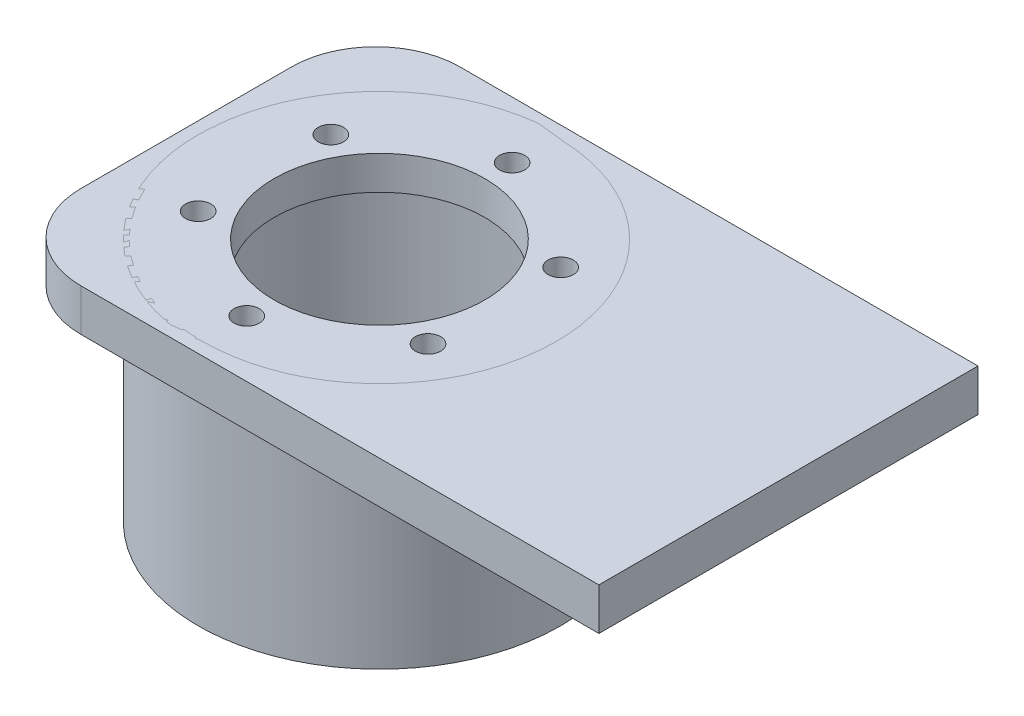
ISO-10303-21;
HEADER;
FILE_DESCRIPTION(('STEP AP214'),'2;1');
FILE_NAME('part.step','',(''),(''),'','','');
FILE_SCHEMA(('AUTOMOTIVE_DESIGN { 1 0 10303 214 1 1 1 1 }'));
ENDSEC;
DATA;
#1=APPLICATION_CONTEXT('core data for automotive mechanical design processes');
#2=APPLICATION_PROTOCOL_DEFINITION('international standard','automotive_design',2000,#1);
#3=PRODUCT_CONTEXT('',#1,'mechanical');
#4=PRODUCT('Part','Part','',(#3));
#5=PRODUCT_RELATED_PRODUCT_CATEGORY('part','',(#4));
#6=PRODUCT_DEFINITION_FORMATION('','',#4);
#7=PRODUCT_DEFINITION_CONTEXT('part definition',#1,'design');
#8=PRODUCT_DEFINITION('design','',#6,#7);
#9=PRODUCT_DEFINITION_SHAPE('','',#8);
#10=(LENGTH_UNIT() NAMED_UNIT(*) SI_UNIT(.MILLI.,.METRE.));
#11=(NAMED_UNIT(*) PLANE_ANGLE_UNIT() SI_UNIT($,.RADIAN.));
#12=(NAMED_UNIT(*) SI_UNIT($,.STERADIAN.) SOLID_ANGLE_UNIT());
#13=UNCERTAINTY_MEASURE_WITH_UNIT(LENGTH_MEASURE(1.E-05),#10,'distance_accuracy_value','');
#14=(GEOMETRIC_REPRESENTATION_CONTEXT(3) GLOBAL_UNCERTAINTY_ASSIGNED_CONTEXT((#13)) GLOBAL_UNIT_ASSIGNED_CONTEXT((#10,
#11,#12)) REPRESENTATION_CONTEXT('',''));
#15=CARTESIAN_POINT('',(0.,0.,0.));
#16=DIRECTION('',(0.,0.,1.));
#17=DIRECTION('',(1.,0.,0.));
#18=AXIS2_PLACEMENT_3D('',#15,#16,#17);
#19=CARTESIAN_POINT('',(0.,-24.,0.));
#20=DIRECTION('',(0.,-1.,0.));
#21=DIRECTION('',(1.,0.,0.));
#22=AXIS2_PLACEMENT_3D('',#19,#20,#21);
#23=PLANE('',#22);
#24=CARTESIAN_POINT('',(0.,-24.,0.));
#25=DIRECTION('',(0.,-1.,0.));
#26=DIRECTION('',(1.,0.,0.));
#27=AXIS2_PLACEMENT_3D('',#24,#25,#26);
#28=CIRCLE('',#27,21.5);
#29=CARTESIAN_POINT('',(21.5,-24.,0.));
#30=VERTEX_POINT('',#29);
#31=EDGE_CURVE('E11',#30,#30,#28,.T.);
#32=ORIENTED_EDGE('',*,*,#31,.T.);
#33=EDGE_LOOP('',(#32));
#34=FACE_BOUND('',#33,.T.);
#35=CARTESIAN_POINT('',(0.,-24.,0.));
#36=DIRECTION('',(0.,-1.,0.));
#37=DIRECTION('',(1.,0.,0.));
#38=AXIS2_PLACEMENT_3D('',#35,#36,#37);
#39=CIRCLE('',#38,19.);
#40=CARTESIAN_POINT('',(19.,-24.,0.));
#41=VERTEX_POINT('',#40);
#42=EDGE_CURVE('E54',#41,#41,#39,.T.);
#43=ORIENTED_EDGE('',*,*,#42,.F.);
#44=EDGE_LOOP('',(#43));
#45=FACE_BOUND('',#44,.T.);
#46=ADVANCED_FACE('F47',(#34,#45),#23,.T.);
#47=CARTESIAN_POINT('',(0.,-24.,0.));
#48=DIRECTION('',(0.,1.,0.));
#49=DIRECTION('',(-1.,0.,0.));
#50=AXIS2_PLACEMENT_3D('',#47,#48,#49);
#51=CYLINDRICAL_SURFACE('',#50,21.5);
#52=ORIENTED_EDGE('',*,*,#31,.F.);
#53=EDGE_LOOP('',(#52));
#54=FACE_BOUND('',#53,.T.);
#55=CARTESIAN_POINT('',(0.,5.,0.));
#56=DIRECTION('',(0.,1.,0.));
#57=DIRECTION('',(-1.,0.,0.));
#58=AXIS2_PLACEMENT_3D('',#55,#56,#57);
#59=CIRCLE('',#58,21.5);
#60=CARTESIAN_POINT('',(-21.5,5.,0.));
#61=VERTEX_POINT('',#60);
#62=EDGE_CURVE('E63',#61,#61,#59,.T.);
#63=ORIENTED_EDGE('',*,*,#62,.F.);
#64=EDGE_LOOP('',(#63));
#65=FACE_BOUND('',#64,.T.);
#66=ADVANCED_FACE('F49',(#54,#65),#51,.T.);
#67=CARTESIAN_POINT('',(0.,-24.,0.));
#68=DIRECTION('',(0.,1.,0.));
#69=DIRECTION('',(-1.,0.,0.));
#70=AXIS2_PLACEMENT_3D('',#67,#68,#69);
#71=CYLINDRICAL_SURFACE('',#70,19.);
#72=ORIENTED_EDGE('',*,*,#42,.T.);
#73=EDGE_LOOP('',(#72));
#74=FACE_BOUND('',#73,.T.);
#75=CARTESIAN_POINT('',(0.,1.,0.));
#76=DIRECTION('',(0.,-1.,0.));
#77=DIRECTION('',(1.,0.,0.));
#78=AXIS2_PLACEMENT_3D('',#75,#76,#77);
#79=CIRCLE('',#78,19.);
#80=CARTESIAN_POINT('',(19.,1.,0.));
#81=VERTEX_POINT('',#80);
#82=EDGE_CURVE('E58',#81,#81,#79,.T.);
#83=ORIENTED_EDGE('',*,*,#82,.F.);
#84=EDGE_LOOP('',(#83));
#85=FACE_BOUND('',#84,.T.);
#86=ADVANCED_FACE('F136',(#74,#85),#71,.F.);
#87=CARTESIAN_POINT('',(0.,1.,0.));
#88=DIRECTION('',(0.,1.,0.));
#89=DIRECTION('',(-1.,0.,0.));
#90=AXIS2_PLACEMENT_3D('',#87,#88,#89);
#91=PLANE('',#90);
#92=CARTESIAN_POINT('',(-13.6399001096048,1.,7.87500000000016));
#93=DIRECTION('',(0.,1.,0.));
#94=DIRECTION('',(-1.,0.,0.));
#95=AXIS2_PLACEMENT_3D('',#92,#93,#94);
#96=CIRCLE('',#95,1.5);
#97=CARTESIAN_POINT('',(-15.1399001096048,1.,7.87500000000016));
#98=VERTEX_POINT('',#97);
#99=EDGE_CURVE('E79',#98,#98,#96,.T.);
#100=ORIENTED_EDGE('',*,*,#99,.T.);
#101=EDGE_LOOP('',(#100));
#102=FACE_BOUND('',#101,.T.);
#103=CARTESIAN_POINT('',(-13.639900109605,1.,-7.87499999999987));
#104=DIRECTION('',(0.,1.,0.));
#105=DIRECTION('',(-1.,0.,0.));
#106=AXIS2_PLACEMENT_3D('',#103,#104,#105);
#107=CIRCLE('',#106,1.5);
#108=CARTESIAN_POINT('',(-15.139900109605,1.,-7.87499999999987));
#109=VERTEX_POINT('',#108);
#110=EDGE_CURVE('E82',#109,#109,#107,.T.);
#111=ORIENTED_EDGE('',*,*,#110,.T.);
#112=EDGE_LOOP('',(#111));
#113=FACE_BOUND('',#112,.T.);
#114=CARTESIAN_POINT('',(0.,1.,-15.75));
#115=DIRECTION('',(0.,1.,0.));
#116=DIRECTION('',(-1.,0.,0.));
#117=AXIS2_PLACEMENT_3D('',#114,#115,#116);
#118=CIRCLE('',#117,1.5);
#119=CARTESIAN_POINT('',(-1.5,1.,-15.75));
#120=VERTEX_POINT('',#119);
#121=EDGE_CURVE('E85',#120,#120,#118,.T.);
#122=ORIENTED_EDGE('',*,*,#121,.T.);
#123=EDGE_LOOP('',(#122));
#124=FACE_BOUND('',#123,.T.);
#125=CARTESIAN_POINT('',(13.6399001096049,1.,-7.87500000000006));
#126=DIRECTION('',(0.,1.,0.));
#127=DIRECTION('',(-1.,0.,0.));
#128=AXIS2_PLACEMENT_3D('',#125,#126,#127);
#129=CIRCLE('',#128,1.5);
#130=CARTESIAN_POINT('',(12.1399001096049,1.,-7.87500000000006));
#131=VERTEX_POINT('',#130);
#132=EDGE_CURVE('E88',#131,#131,#129,.T.);
#133=ORIENTED_EDGE('',*,*,#132,.T.);
#134=EDGE_LOOP('',(#133));
#135=FACE_BOUND('',#134,.T.);
#136=CARTESIAN_POINT('',(13.6399001096049,1.,7.87499999999997));
#137=DIRECTION('',(0.,1.,0.));
#138=DIRECTION('',(-1.,0.,0.));
#139=AXIS2_PLACEMENT_3D('',#136,#137,#138);
#140=CIRCLE('',#139,1.5);
#141=CARTESIAN_POINT('',(12.1399001096049,1.,7.87499999999997));
#142=VERTEX_POINT('',#141);
#143=EDGE_CURVE('E91',#142,#142,#140,.T.);
#144=ORIENTED_EDGE('',*,*,#143,.T.);
#145=EDGE_LOOP('',(#144));
#146=FACE_BOUND('',#145,.T.);
#147=CARTESIAN_POINT('',(0.,1.,15.75));
#148=DIRECTION('',(0.,1.,0.));
#149=DIRECTION('',(-1.,0.,0.));
#150=AXIS2_PLACEMENT_3D('',#147,#148,#149);
#151=CIRCLE('',#150,1.5);
#152=CARTESIAN_POINT('',(-1.5,1.,15.75));
#153=VERTEX_POINT('',#152);
#154=EDGE_CURVE('E71',#153,#153,#151,.T.);
#155=ORIENTED_EDGE('',*,*,#154,.T.);
#156=EDGE_LOOP('',(#155));
#157=FACE_BOUND('',#156,.T.);
#158=CARTESIAN_POINT('',(0.,1.,0.));
#159=DIRECTION('',(0.,1.,0.));
#160=DIRECTION('',(-1.,0.,0.));
#161=AXIS2_PLACEMENT_3D('',#158,#159,#160);
#162=CIRCLE('',#161,12.5);
#163=CARTESIAN_POINT('',(-12.5,1.,0.));
#164=VERTEX_POINT('',#163);
#165=EDGE_CURVE('E68',#164,#164,#162,.T.);
#166=ORIENTED_EDGE('',*,*,#165,.T.);
#167=EDGE_LOOP('',(#166));
#168=FACE_BOUND('',#167,.T.);
#169=ORIENTED_EDGE('',*,*,#82,.T.);
#170=EDGE_LOOP('',(#169));
#171=FACE_BOUND('',#170,.T.);
#172=ADVANCED_FACE('F117',(#102,#113,#124,#135,#146,#157,#168,#171),#91,.F.);
#173=CARTESIAN_POINT('',(0.,5.,0.));
#174=DIRECTION('',(0.,1.,0.));
#175=DIRECTION('',(-1.,0.,0.));
#176=AXIS2_PLACEMENT_3D('',#173,#174,#175);
#177=PLANE('',#176);
#178=CARTESIAN_POINT('',(-13.6399001096048,5.,7.87500000000016));
#179=DIRECTION('',(0.,1.,0.));
#180=DIRECTION('',(-0.50000000000001,0.,-0.866025403784433));
#181=AXIS2_PLACEMENT_3D('',#178,#179,#180);
#182=CIRCLE('',#181,1.5);
#183=CARTESIAN_POINT('',(-14.3899001096048,5.,6.57596189432351));
#184=VERTEX_POINT('',#183);
#185=EDGE_CURVE('E98',#184,#184,#182,.T.);
#186=ORIENTED_EDGE('',*,*,#185,.F.);
#187=EDGE_LOOP('',(#186));
#188=FACE_BOUND('',#187,.T.);
#189=CARTESIAN_POINT('',(-13.639900109605,5.,-7.87499999999987));
#190=DIRECTION('',(0.,1.,0.));
#191=DIRECTION('',(0.499999999999992,0.,-0.866025403784443));
#192=AXIS2_PLACEMENT_3D('',#189,#190,#191);
#193=CIRCLE('',#192,1.5);
#194=CARTESIAN_POINT('',(-12.889900109605,5.,-9.17403810567654));
#195=VERTEX_POINT('',#194);
#196=EDGE_CURVE('E101',#195,#195,#193,.T.);
#197=ORIENTED_EDGE('',*,*,#196,.F.);
#198=EDGE_LOOP('',(#197));
#199=FACE_BOUND('',#198,.T.);
#200=CARTESIAN_POINT('',(0.,5.,-15.75));
#201=DIRECTION('',(0.,1.,0.));
#202=DIRECTION('',(1.,0.,0.));
#203=AXIS2_PLACEMENT_3D('',#200,#201,#202);
#204=CIRCLE('',#203,1.5);
#205=CARTESIAN_POINT('',(1.5,5.,-15.75));
#206=VERTEX_POINT('',#205);
#207=EDGE_CURVE('E104',#206,#206,#204,.T.);
#208=ORIENTED_EDGE('',*,*,#207,.F.);
#209=EDGE_LOOP('',(#208));
#210=FACE_BOUND('',#209,.T.);
#211=CARTESIAN_POINT('',(13.6399001096049,5.,-7.87500000000006));
#212=DIRECTION('',(0.,1.,0.));
#213=DIRECTION('',(0.500000000000004,0.,0.866025403784436));
#214=AXIS2_PLACEMENT_3D('',#211,#212,#213);
#215=CIRCLE('',#214,1.5);
#216=CARTESIAN_POINT('',(14.3899001096049,5.,-6.57596189432341));
#217=VERTEX_POINT('',#216);
#218=EDGE_CURVE('E97',#217,#217,#215,.T.);
#219=ORIENTED_EDGE('',*,*,#218,.F.);
#220=EDGE_LOOP('',(#219));
#221=FACE_BOUND('',#220,.T.);
#222=CARTESIAN_POINT('',(13.6399001096049,5.,7.87499999999997));
#223=DIRECTION('',(0.,1.,0.));
#224=DIRECTION('',(-0.499999999999998,0.,0.86602540378444));
#225=AXIS2_PLACEMENT_3D('',#222,#223,#224);
#226=CIRCLE('',#225,1.5);
#227=CARTESIAN_POINT('',(12.8899001096049,5.,9.17403810567663));
#228=VERTEX_POINT('',#227);
#229=EDGE_CURVE('E94',#228,#228,#226,.T.);
#230=ORIENTED_EDGE('',*,*,#229,.F.);
#231=EDGE_LOOP('',(#230));
#232=FACE_BOUND('',#231,.T.);
#233=CARTESIAN_POINT('',(0.,5.,15.75));
#234=DIRECTION('',(0.,1.,0.));
#235=DIRECTION('',(-1.,0.,0.));
#236=AXIS2_PLACEMENT_3D('',#233,#234,#235);
#237=CIRCLE('',#236,1.5);
#238=CARTESIAN_POINT('',(-1.5,5.,15.75));
#239=VERTEX_POINT('',#238);
#240=EDGE_CURVE('E76',#239,#239,#237,.T.);
#241=ORIENTED_EDGE('',*,*,#240,.F.);
#242=EDGE_LOOP('',(#241));
#243=FACE_BOUND('',#242,.T.);
#244=ORIENTED_EDGE('',*,*,#62,.T.);
#245=EDGE_LOOP('',(#244));
#246=FACE_BOUND('',#245,.T.);
#247=CARTESIAN_POINT('',(0.,5.,0.));
#248=DIRECTION('',(0.,1.,0.));
#249=DIRECTION('',(-1.,0.,0.));
#250=AXIS2_PLACEMENT_3D('',#247,#248,#249);
#251=CIRCLE('',#250,12.5);
#252=CARTESIAN_POINT('',(-12.5,5.,0.));
#253=VERTEX_POINT('',#252);
#254=EDGE_CURVE('E67',#253,#253,#251,.T.);
#255=ORIENTED_EDGE('',*,*,#254,.F.);
#256=EDGE_LOOP('',(#255));
#257=FACE_BOUND('',#256,.T.);
#258=ADVANCED_FACE('F113',(#188,#199,#210,#221,#232,#243,#246,#257),#177,.T.);
#259=CARTESIAN_POINT('',(0.,5.,0.));
#260=DIRECTION('',(0.,-1.,0.));
#261=DIRECTION('',(1.,0.,0.));
#262=AXIS2_PLACEMENT_3D('',#259,#260,#261);
#263=CYLINDRICAL_SURFACE('',#262,12.5);
#264=ORIENTED_EDGE('',*,*,#254,.T.);
#265=EDGE_LOOP('',(#264));
#266=FACE_BOUND('',#265,.T.);
#267=ORIENTED_EDGE('',*,*,#165,.F.);
#268=EDGE_LOOP('',(#267));
#269=FACE_BOUND('',#268,.T.);
#270=ADVANCED_FACE('F116',(#266,#269),#263,.F.);
#271=CARTESIAN_POINT('',(0.,0.,15.75));
#272=DIRECTION('',(0.,1.,0.));
#273=DIRECTION('',(-1.,0.,0.));
#274=AXIS2_PLACEMENT_3D('',#271,#272,#273);
#275=CYLINDRICAL_SURFACE('',#274,1.5);
#276=ORIENTED_EDGE('',*,*,#240,.T.);
#277=EDGE_LOOP('',(#276));
#278=FACE_BOUND('',#277,.T.);
#279=ORIENTED_EDGE('',*,*,#154,.F.);
#280=EDGE_LOOP('',(#279));
#281=FACE_BOUND('',#280,.T.);
#282=ADVANCED_FACE('F130',(#278,#281),#275,.F.);
#283=CARTESIAN_POINT('',(13.6399001096049,0.,7.87499999999997));
#284=DIRECTION('',(0.,1.,0.));
#285=DIRECTION('',(-1.,0.,0.));
#286=AXIS2_PLACEMENT_3D('',#283,#284,#285);
#287=CYLINDRICAL_SURFACE('',#286,1.5);
#288=ORIENTED_EDGE('',*,*,#229,.T.);
#289=EDGE_LOOP('',(#288));
#290=FACE_BOUND('',#289,.T.);
#291=ORIENTED_EDGE('',*,*,#143,.F.);
#292=EDGE_LOOP('',(#291));
#293=FACE_BOUND('',#292,.T.);
#294=ADVANCED_FACE('F178',(#290,#293),#287,.F.);
#295=CARTESIAN_POINT('',(13.6399001096049,0.,-7.87500000000006));
#296=DIRECTION('',(0.,1.,0.));
#297=DIRECTION('',(-1.,0.,0.));
#298=AXIS2_PLACEMENT_3D('',#295,#296,#297);
#299=CYLINDRICAL_SURFACE('',#298,1.5);
#300=ORIENTED_EDGE('',*,*,#218,.T.);
#301=EDGE_LOOP('',(#300));
#302=FACE_BOUND('',#301,.T.);
#303=ORIENTED_EDGE('',*,*,#132,.F.);
#304=EDGE_LOOP('',(#303));
#305=FACE_BOUND('',#304,.T.);
#306=ADVANCED_FACE('F110',(#302,#305),#299,.F.);
#307=CARTESIAN_POINT('',(0.,0.,-15.75));
#308=DIRECTION('',(0.,1.,0.));
#309=DIRECTION('',(-1.,0.,0.));
#310=AXIS2_PLACEMENT_3D('',#307,#308,#309);
#311=CYLINDRICAL_SURFACE('',#310,1.5);
#312=ORIENTED_EDGE('',*,*,#207,.T.);
#313=EDGE_LOOP('',(#312));
#314=FACE_BOUND('',#313,.T.);
#315=ORIENTED_EDGE('',*,*,#121,.F.);
#316=EDGE_LOOP('',(#315));
#317=FACE_BOUND('',#316,.T.);
#318=ADVANCED_FACE('F194',(#314,#317),#311,.F.);
#319=CARTESIAN_POINT('',(-13.639900109605,0.,-7.87499999999987));
#320=DIRECTION('',(0.,1.,0.));
#321=DIRECTION('',(-1.,0.,0.));
#322=AXIS2_PLACEMENT_3D('',#319,#320,#321);
#323=CYLINDRICAL_SURFACE('',#322,1.5);
#324=ORIENTED_EDGE('',*,*,#196,.T.);
#325=EDGE_LOOP('',(#324));
#326=FACE_BOUND('',#325,.T.);
#327=ORIENTED_EDGE('',*,*,#110,.F.);
#328=EDGE_LOOP('',(#327));
#329=FACE_BOUND('',#328,.T.);
#330=ADVANCED_FACE('F201',(#326,#329),#323,.F.);
#331=CARTESIAN_POINT('',(-13.6399001096048,0.,7.87500000000016));
#332=DIRECTION('',(0.,1.,0.));
#333=DIRECTION('',(-1.,0.,0.));
#334=AXIS2_PLACEMENT_3D('',#331,#332,#333);
#335=CYLINDRICAL_SURFACE('',#334,1.5);
#336=ORIENTED_EDGE('',*,*,#185,.T.);
#337=EDGE_LOOP('',(#336));
#338=FACE_BOUND('',#337,.T.);
#339=ORIENTED_EDGE('',*,*,#99,.F.);
#340=EDGE_LOOP('',(#339));
#341=FACE_BOUND('',#340,.T.);
#342=ADVANCED_FACE('F209',(#338,#341),#335,.F.);
#343=CLOSED_SHELL('',(#46,#66,#86,#172,#258,#270,#282,#294,#306,#318,#330,#342));
#344=MANIFOLD_SOLID_BREP('B2',#343);
#345=CARTESIAN_POINT('',(48.55,5.,-22.5));
#346=DIRECTION('',(-1.,0.,0.));
#347=DIRECTION('',(0.,0.,1.));
#348=AXIS2_PLACEMENT_3D('',#345,#346,#347);
#349=PLANE('',#348);
#350=DIRECTION('',(0.,0.,-1.));
#351=VECTOR('',#350,1.);
#352=CARTESIAN_POINT('',(48.55,0.,-22.5));
#353=LINE('',#352,#351);
#354=CARTESIAN_POINT('',(48.55,0.,22.5));
#355=VERTEX_POINT('',#354);
#356=CARTESIAN_POINT('',(48.55,0.,-22.5));
#357=VERTEX_POINT('',#356);
#358=EDGE_CURVE('E318',#355,#357,#353,.T.);
#359=ORIENTED_EDGE('',*,*,#358,.T.);
#360=DIRECTION('',(0.,-1.,0.));
#361=VECTOR('',#360,1.);
#362=CARTESIAN_POINT('',(48.55,5.,-22.5));
#363=LINE('',#362,#361);
#364=CARTESIAN_POINT('',(48.55,5.,-22.5));
#365=VERTEX_POINT('',#364);
#366=EDGE_CURVE('E301',#365,#357,#363,.T.);
#367=ORIENTED_EDGE('',*,*,#366,.F.);
#368=DIRECTION('',(0.,0.,-1.));
#369=VECTOR('',#368,1.);
#370=CARTESIAN_POINT('',(48.55,5.,-22.5));
#371=LINE('',#370,#369);
#372=CARTESIAN_POINT('',(48.55,5.,22.5));
#373=VERTEX_POINT('',#372);
#374=EDGE_CURVE('E307',#373,#365,#371,.T.);
#375=ORIENTED_EDGE('',*,*,#374,.F.);
#376=DIRECTION('',(0.,-1.,0.));
#377=VECTOR('',#376,1.);
#378=CARTESIAN_POINT('',(48.55,5.,22.5));
#379=LINE('',#378,#377);
#380=EDGE_CURVE('E320',#373,#355,#379,.T.);
#381=ORIENTED_EDGE('',*,*,#380,.T.);
#382=EDGE_LOOP('',(#359,#367,#375,#381));
#383=FACE_BOUND('',#382,.T.);
#384=ADVANCED_FACE('F244',(#383),#349,.F.);
#385=CARTESIAN_POINT('',(-61.45,5.,-22.5));
#386=DIRECTION('',(0.,0.,1.));
#387=DIRECTION('',(1.,0.,0.));
#388=AXIS2_PLACEMENT_3D('',#385,#386,#387);
#389=PLANE('',#388);
#390=DIRECTION('',(-1.,0.,0.));
#391=VECTOR('',#390,1.);
#392=CARTESIAN_POINT('',(-61.45,0.,-22.5));
#393=LINE('',#392,#391);
#394=CARTESIAN_POINT('',(-12.9349943342321,0.,-22.5));
#395=VERTEX_POINT('',#394);
#396=EDGE_CURVE('E355',#357,#395,#393,.T.);
#397=ORIENTED_EDGE('',*,*,#396,.T.);
#398=DIRECTION('',(0.,1.,0.));
#399=VECTOR('',#398,1.);
#400=CARTESIAN_POINT('',(-12.9349943342321,5.,-22.5));
#401=LINE('',#400,#399);
#402=CARTESIAN_POINT('',(-12.9349943342321,5.,-22.5));
#403=VERTEX_POINT('',#402);
#404=EDGE_CURVE('E304',#395,#403,#401,.T.);
#405=ORIENTED_EDGE('',*,*,#404,.T.);
#406=DIRECTION('',(-1.,0.,0.));
#407=VECTOR('',#406,1.);
#408=CARTESIAN_POINT('',(-61.45,5.,-22.5));
#409=LINE('',#408,#407);
#410=EDGE_CURVE('E296',#365,#403,#409,.T.);
#411=ORIENTED_EDGE('',*,*,#410,.F.);
#412=ORIENTED_EDGE('',*,*,#366,.T.);
#413=EDGE_LOOP('',(#397,#405,#411,#412));
#414=FACE_BOUND('',#413,.T.);
#415=ADVANCED_FACE('F299',(#414),#389,.F.);
#416=CARTESIAN_POINT('',(-61.45,5.,22.5));
#417=DIRECTION('',(0.,0.,-1.));
#418=DIRECTION('',(-1.,0.,0.));
#419=AXIS2_PLACEMENT_3D('',#416,#417,#418);
#420=PLANE('',#419);
#421=DIRECTION('',(1.,0.,0.));
#422=VECTOR('',#421,1.);
#423=CARTESIAN_POINT('',(-61.45,5.,22.5));
#424=LINE('',#423,#422);
#425=CARTESIAN_POINT('',(-12.9349943342321,5.,22.5));
#426=VERTEX_POINT('',#425);
#427=EDGE_CURVE('E306',#426,#373,#424,.T.);
#428=ORIENTED_EDGE('',*,*,#427,.F.);
#429=DIRECTION('',(0.,1.,0.));
#430=VECTOR('',#429,1.);
#431=CARTESIAN_POINT('',(-12.9349943342321,5.,22.5));
#432=LINE('',#431,#430);
#433=CARTESIAN_POINT('',(-12.9349943342321,0.,22.5));
#434=VERTEX_POINT('',#433);
#435=EDGE_CURVE('E252',#426,#434,#432,.F.);
#436=ORIENTED_EDGE('',*,*,#435,.T.);
#437=DIRECTION('',(1.,0.,0.));
#438=VECTOR('',#437,1.);
#439=CARTESIAN_POINT('',(-61.45,0.,22.5));
#440=LINE('',#439,#438);
#441=EDGE_CURVE('E315',#434,#355,#440,.T.);
#442=ORIENTED_EDGE('',*,*,#441,.T.);
#443=ORIENTED_EDGE('',*,*,#380,.F.);
#444=EDGE_LOOP('',(#428,#436,#442,#443));
#445=FACE_BOUND('',#444,.T.);
#446=ADVANCED_FACE('F356',(#445),#420,.F.);
#447=CARTESIAN_POINT('',(0.,5.,0.));
#448=DIRECTION('',(0.,1.,0.));
#449=DIRECTION('',(0.,0.,1.));
#450=AXIS2_PLACEMENT_3D('',#447,#448,#449);
#451=PLANE('',#450);
#452=DIRECTION('',(0.,0.,-1.));
#453=VECTOR('',#452,1.);
#454=CARTESIAN_POINT('',(-22.9349943342321,5.,-22.5));
#455=LINE('',#454,#453);
#456=CARTESIAN_POINT('',(-22.9349943342321,5.,12.5));
#457=VERTEX_POINT('',#456);
#458=CARTESIAN_POINT('',(-22.9349943342321,5.,-12.5));
#459=VERTEX_POINT('',#458);
#460=EDGE_CURVE('E341',#457,#459,#455,.T.);
#461=ORIENTED_EDGE('',*,*,#460,.F.);
#462=CARTESIAN_POINT('',(-12.9349943342321,5.,12.5));
#463=DIRECTION('',(0.,1.,0.));
#464=DIRECTION('',(0.,0.,1.));
#465=AXIS2_PLACEMENT_3D('',#462,#463,#464);
#466=CIRCLE('',#465,10.);
#467=EDGE_CURVE('E266',#457,#426,#466,.T.);
#468=ORIENTED_EDGE('',*,*,#467,.T.);
#469=ORIENTED_EDGE('',*,*,#427,.T.);
#470=ORIENTED_EDGE('',*,*,#374,.T.);
#471=ORIENTED_EDGE('',*,*,#410,.T.);
#472=CARTESIAN_POINT('',(-12.9349943342321,5.,-12.5));
#473=DIRECTION('',(0.,1.,0.));
#474=DIRECTION('',(0.,0.,1.));
#475=AXIS2_PLACEMENT_3D('',#472,#473,#474);
#476=CIRCLE('',#475,10.);
#477=EDGE_CURVE('E327',#403,#459,#476,.T.);
#478=ORIENTED_EDGE('',*,*,#477,.T.);
#479=EDGE_LOOP('',(#461,#468,#469,#470,#471,#478));
#480=FACE_BOUND('',#479,.T.);
#481=CARTESIAN_POINT('',(0.,5.,0.));
#482=DIRECTION('',(0.,1.,0.));
#483=DIRECTION('',(0.,0.,1.));
#484=AXIS2_PLACEMENT_3D('',#481,#482,#483);
#485=CIRCLE('',#484,21.);
#486=CARTESIAN_POINT('',(0.,5.,21.));
#487=VERTEX_POINT('',#486);
#488=EDGE_CURVE('E345',#487,#487,#485,.T.);
#489=ORIENTED_EDGE('',*,*,#488,.F.);
#490=EDGE_LOOP('',(#489));
#491=FACE_BOUND('',#490,.T.);
#492=ADVANCED_FACE('F310',(#480,#491),#451,.T.);
#493=CARTESIAN_POINT('',(0.,0.,0.));
#494=DIRECTION('',(0.,1.,0.));
#495=DIRECTION('',(0.,0.,1.));
#496=AXIS2_PLACEMENT_3D('',#493,#494,#495);
#497=PLANE('',#496);
#498=CARTESIAN_POINT('',(0.,0.,0.));
#499=DIRECTION('',(0.,1.,0.));
#500=DIRECTION('',(0.,0.,1.));
#501=AXIS2_PLACEMENT_3D('',#498,#499,#500);
#502=CIRCLE('',#501,21.);
#503=CARTESIAN_POINT('',(0.,0.,21.));
#504=VERTEX_POINT('',#503);
#505=EDGE_CURVE('E348',#504,#504,#502,.T.);
#506=ORIENTED_EDGE('',*,*,#505,.T.);
#507=EDGE_LOOP('',(#506));
#508=FACE_BOUND('',#507,.T.);
#509=ORIENTED_EDGE('',*,*,#441,.F.);
#510=CARTESIAN_POINT('',(-12.9349943342321,0.,12.5));
#511=DIRECTION('',(0.,1.,0.));
#512=DIRECTION('',(0.,0.,1.));
#513=AXIS2_PLACEMENT_3D('',#510,#511,#512);
#514=CIRCLE('',#513,10.);
#515=CARTESIAN_POINT('',(-22.9349943342321,0.,12.5));
#516=VERTEX_POINT('',#515);
#517=EDGE_CURVE('E45',#434,#516,#514,.F.);
#518=ORIENTED_EDGE('',*,*,#517,.T.);
#519=DIRECTION('',(0.,0.,-1.));
#520=VECTOR('',#519,1.);
#521=CARTESIAN_POINT('',(-22.9349943342321,0.,0.));
#522=LINE('',#521,#520);
#523=CARTESIAN_POINT('',(-22.9349943342321,0.,-12.5));
#524=VERTEX_POINT('',#523);
#525=EDGE_CURVE('E319',#516,#524,#522,.T.);
#526=ORIENTED_EDGE('',*,*,#525,.T.);
#527=CARTESIAN_POINT('',(-12.9349943342321,0.,-12.5));
#528=DIRECTION('',(0.,1.,0.));
#529=DIRECTION('',(0.,0.,1.));
#530=AXIS2_PLACEMENT_3D('',#527,#528,#529);
#531=CIRCLE('',#530,10.);
#532=EDGE_CURVE('E332',#524,#395,#531,.F.);
#533=ORIENTED_EDGE('',*,*,#532,.T.);
#534=ORIENTED_EDGE('',*,*,#396,.F.);
#535=ORIENTED_EDGE('',*,*,#358,.F.);
#536=EDGE_LOOP('',(#509,#518,#526,#533,#534,#535));
#537=FACE_BOUND('',#536,.T.);
#538=ADVANCED_FACE('F358',(#508,#537),#497,.F.);
#539=CARTESIAN_POINT('',(0.,0.,0.));
#540=DIRECTION('',(0.,1.,0.));
#541=DIRECTION('',(0.,0.,1.));
#542=AXIS2_PLACEMENT_3D('',#539,#540,#541);
#543=CYLINDRICAL_SURFACE('',#542,21.);
#544=ORIENTED_EDGE('',*,*,#505,.F.);
#545=EDGE_LOOP('',(#544));
#546=FACE_BOUND('',#545,.T.);
#547=ORIENTED_EDGE('',*,*,#488,.T.);
#548=EDGE_LOOP('',(#547));
#549=FACE_BOUND('',#548,.T.);
#550=ADVANCED_FACE('F367',(#546,#549),#543,.F.);
#551=CARTESIAN_POINT('',(-22.9349943342321,-5.,-22.5));
#552=DIRECTION('',(1.,0.,0.));
#553=DIRECTION('',(0.,0.,-1.));
#554=AXIS2_PLACEMENT_3D('',#551,#552,#553);
#555=PLANE('',#554);
#556=ORIENTED_EDGE('',*,*,#525,.F.);
#557=DIRECTION('',(0.,1.,0.));
#558=VECTOR('',#557,1.);
#559=CARTESIAN_POINT('',(-22.9349943342321,-5.,12.5));
#560=LINE('',#559,#558);
#561=EDGE_CURVE('E334',#516,#457,#560,.T.);
#562=ORIENTED_EDGE('',*,*,#561,.T.);
#563=ORIENTED_EDGE('',*,*,#460,.T.);
#564=DIRECTION('',(0.,1.,0.));
#565=VECTOR('',#564,1.);
#566=CARTESIAN_POINT('',(-22.9349943342321,-5.,-12.5));
#567=LINE('',#566,#565);
#568=EDGE_CURVE('E329',#459,#524,#567,.F.);
#569=ORIENTED_EDGE('',*,*,#568,.T.);
#570=EDGE_LOOP('',(#556,#562,#563,#569));
#571=FACE_BOUND('',#570,.T.);
#572=ADVANCED_FACE('F340',(#571),#555,.F.);
#573=CARTESIAN_POINT('',(-12.9349943342321,5.,-12.5));
#574=DIRECTION('',(0.,1.,0.));
#575=DIRECTION('',(0.,0.,1.));
#576=AXIS2_PLACEMENT_3D('',#573,#574,#575);
#577=CYLINDRICAL_SURFACE('',#576,10.);
#578=ORIENTED_EDGE('',*,*,#532,.F.);
#579=ORIENTED_EDGE('',*,*,#568,.F.);
#580=ORIENTED_EDGE('',*,*,#477,.F.);
#581=ORIENTED_EDGE('',*,*,#404,.F.);
#582=EDGE_LOOP('',(#578,#579,#580,#581));
#583=FACE_BOUND('',#582,.T.);
#584=ADVANCED_FACE('F361',(#583),#577,.T.);
#585=CARTESIAN_POINT('',(-12.9349943342321,-5.,12.5));
#586=DIRECTION('',(0.,1.,0.));
#587=DIRECTION('',(0.,0.,1.));
#588=AXIS2_PLACEMENT_3D('',#585,#586,#587);
#589=CYLINDRICAL_SURFACE('',#588,10.);
#590=ORIENTED_EDGE('',*,*,#517,.F.);
#591=ORIENTED_EDGE('',*,*,#435,.F.);
#592=ORIENTED_EDGE('',*,*,#467,.F.);
#593=ORIENTED_EDGE('',*,*,#561,.F.);
#594=EDGE_LOOP('',(#590,#591,#592,#593));
#595=FACE_BOUND('',#594,.T.);
#596=ADVANCED_FACE('F246',(#595),#589,.T.);
#597=CLOSED_SHELL('',(#384,#415,#446,#492,#538,#550,#572,#584,#596));
#598=MANIFOLD_SOLID_BREP('B6',#597);
#599=ADVANCED_BREP_SHAPE_REPRESENTATION('',(#18,#344,#598),#14);
#600=SHAPE_DEFINITION_REPRESENTATION(#9,#599);
ENDSEC;
END-ISO-10303-21;
